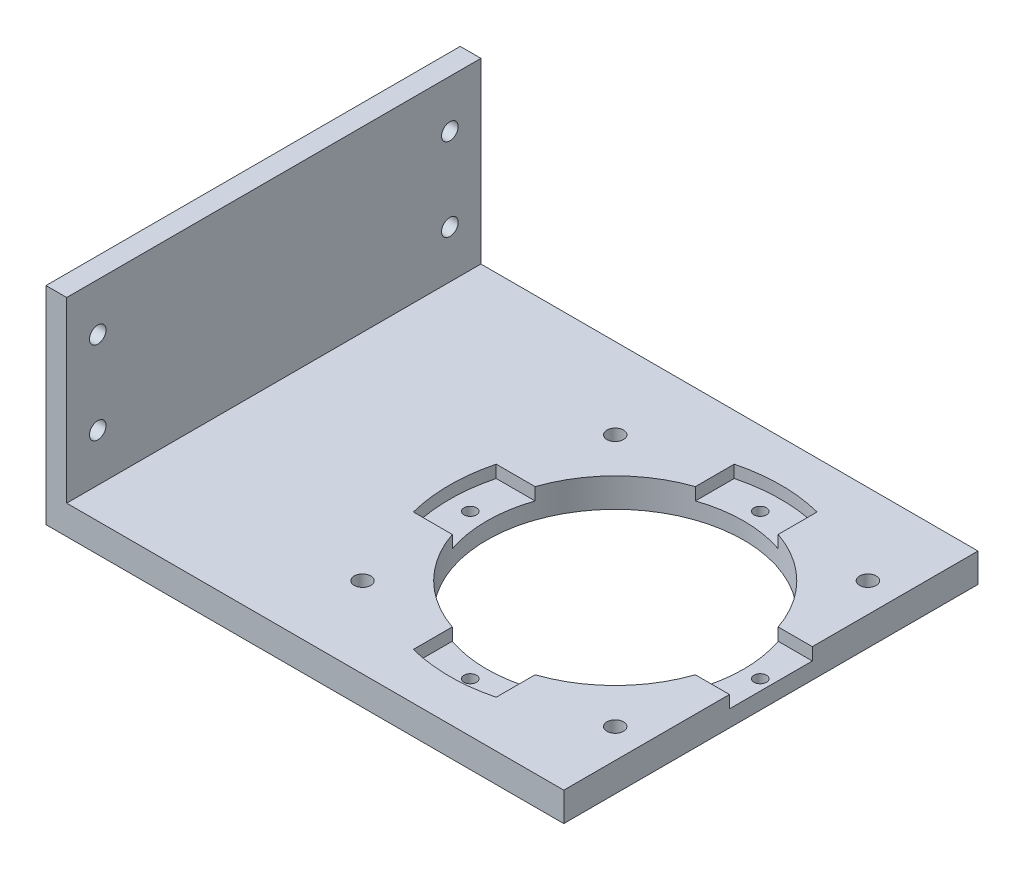
ISO-10303-21;
HEADER;
FILE_DESCRIPTION(('STEP AP214'),'2;1');
FILE_NAME('part.step','',(''),(''),'','','');
FILE_SCHEMA(('AUTOMOTIVE_DESIGN { 1 0 10303 214 1 1 1 1 }'));
ENDSEC;
DATA;
#1=APPLICATION_CONTEXT('core data for automotive mechanical design processes');
#2=APPLICATION_PROTOCOL_DEFINITION('international standard','automotive_design',2000,#1);
#3=PRODUCT_CONTEXT('',#1,'mechanical');
#4=PRODUCT('Part','Part','',(#3));
#5=PRODUCT_RELATED_PRODUCT_CATEGORY('part','',(#4));
#6=PRODUCT_DEFINITION_FORMATION('','',#4);
#7=PRODUCT_DEFINITION_CONTEXT('part definition',#1,'design');
#8=PRODUCT_DEFINITION('design','',#6,#7);
#9=PRODUCT_DEFINITION_SHAPE('','',#8);
#10=(LENGTH_UNIT() NAMED_UNIT(*) SI_UNIT(.MILLI.,.METRE.));
#11=(NAMED_UNIT(*) PLANE_ANGLE_UNIT() SI_UNIT($,.RADIAN.));
#12=(NAMED_UNIT(*) SI_UNIT($,.STERADIAN.) SOLID_ANGLE_UNIT());
#13=UNCERTAINTY_MEASURE_WITH_UNIT(LENGTH_MEASURE(1.E-05),#10,'distance_accuracy_value','');
#14=(GEOMETRIC_REPRESENTATION_CONTEXT(3) GLOBAL_UNCERTAINTY_ASSIGNED_CONTEXT((#13)) GLOBAL_UNIT_ASSIGNED_CONTEXT((#10,
#11,#12)) REPRESENTATION_CONTEXT('',''));
#15=CARTESIAN_POINT('',(0.,0.,0.));
#16=DIRECTION('',(0.,0.,1.));
#17=DIRECTION('',(1.,0.,0.));
#18=AXIS2_PLACEMENT_3D('',#15,#16,#17);
#19=CARTESIAN_POINT('',(0.,50.,100.));
#20=DIRECTION('',(1.,0.,0.));
#21=DIRECTION('',(0.,1.,0.));
#22=AXIS2_PLACEMENT_3D('',#19,#20,#21);
#23=PLANE('',#22);
#24=CARTESIAN_POINT('',(0.,18.5,92.5));
#25=DIRECTION('',(1.,0.,0.));
#26=DIRECTION('',(0.,1.,0.));
#27=AXIS2_PLACEMENT_3D('',#24,#25,#26);
#28=CIRCLE('',#27,2.);
#29=CARTESIAN_POINT('',(0.,20.5,92.5));
#30=VERTEX_POINT('',#29);
#31=EDGE_CURVE('E317',#30,#30,#28,.F.);
#32=ORIENTED_EDGE('',*,*,#31,.F.);
#33=EDGE_LOOP('',(#32));
#34=FACE_BOUND('',#33,.T.);
#35=CARTESIAN_POINT('',(0.,38.5,7.5));
#36=DIRECTION('',(1.,0.,0.));
#37=DIRECTION('',(0.,1.,0.));
#38=AXIS2_PLACEMENT_3D('',#35,#36,#37);
#39=CIRCLE('',#38,2.);
#40=CARTESIAN_POINT('',(0.,40.5,7.5));
#41=VERTEX_POINT('',#40);
#42=EDGE_CURVE('E318',#41,#41,#39,.F.);
#43=ORIENTED_EDGE('',*,*,#42,.F.);
#44=EDGE_LOOP('',(#43));
#45=FACE_BOUND('',#44,.T.);
#46=CARTESIAN_POINT('',(0.,18.5,7.49999999999999));
#47=DIRECTION('',(1.,0.,0.));
#48=DIRECTION('',(0.,1.,0.));
#49=AXIS2_PLACEMENT_3D('',#46,#47,#48);
#50=CIRCLE('',#49,2.);
#51=CARTESIAN_POINT('',(0.,20.5,7.49999999999999));
#52=VERTEX_POINT('',#51);
#53=EDGE_CURVE('E310',#52,#52,#50,.F.);
#54=ORIENTED_EDGE('',*,*,#53,.F.);
#55=EDGE_LOOP('',(#54));
#56=FACE_BOUND('',#55,.T.);
#57=CARTESIAN_POINT('',(0.,38.5,92.5));
#58=DIRECTION('',(1.,0.,0.));
#59=DIRECTION('',(0.,1.,0.));
#60=AXIS2_PLACEMENT_3D('',#57,#58,#59);
#61=CIRCLE('',#60,2.);
#62=CARTESIAN_POINT('',(0.,40.5,92.5));
#63=VERTEX_POINT('',#62);
#64=EDGE_CURVE('E328',#63,#63,#61,.F.);
#65=ORIENTED_EDGE('',*,*,#64,.F.);
#66=EDGE_LOOP('',(#65));
#67=FACE_BOUND('',#66,.T.);
#68=DIRECTION('',(0.,-1.,0.));
#69=VECTOR('',#68,1.);
#70=CARTESIAN_POINT('',(0.,50.,0.));
#71=LINE('',#70,#69);
#72=CARTESIAN_POINT('',(0.,50.,0.));
#73=VERTEX_POINT('',#72);
#74=CARTESIAN_POINT('',(0.,0.,0.));
#75=VERTEX_POINT('',#74);
#76=EDGE_CURVE('E363',#73,#75,#71,.T.);
#77=ORIENTED_EDGE('',*,*,#76,.T.);
#78=DIRECTION('',(0.,0.,-1.));
#79=VECTOR('',#78,1.);
#80=CARTESIAN_POINT('',(0.,0.,100.));
#81=LINE('',#80,#79);
#82=CARTESIAN_POINT('',(0.,0.,100.));
#83=VERTEX_POINT('',#82);
#84=EDGE_CURVE('E13',#83,#75,#81,.T.);
#85=ORIENTED_EDGE('',*,*,#84,.F.);
#86=DIRECTION('',(0.,-1.,0.));
#87=VECTOR('',#86,1.);
#88=CARTESIAN_POINT('',(0.,50.,100.));
#89=LINE('',#88,#87);
#90=CARTESIAN_POINT('',(0.,50.,100.));
#91=VERTEX_POINT('',#90);
#92=EDGE_CURVE('E364',#91,#83,#89,.T.);
#93=ORIENTED_EDGE('',*,*,#92,.F.);
#94=DIRECTION('',(0.,0.,-1.));
#95=VECTOR('',#94,1.);
#96=CARTESIAN_POINT('',(0.,50.,100.));
#97=LINE('',#96,#95);
#98=EDGE_CURVE('E378',#91,#73,#97,.T.);
#99=ORIENTED_EDGE('',*,*,#98,.T.);
#100=EDGE_LOOP('',(#77,#85,#93,#99));
#101=FACE_BOUND('',#100,.T.);
#102=ADVANCED_FACE('F44',(#34,#45,#56,#67,#101),#23,.F.);
#103=CARTESIAN_POINT('',(0.,0.,100.));
#104=DIRECTION('',(0.,1.,0.));
#105=DIRECTION('',(0.,0.,1.));
#106=AXIS2_PLACEMENT_3D('',#103,#104,#105);
#107=PLANE('',#106);
#108=CARTESIAN_POINT('',(87.42,0.,15.));
#109=DIRECTION('',(0.,1.,0.));
#110=DIRECTION('',(0.,0.,1.));
#111=AXIS2_PLACEMENT_3D('',#108,#109,#110);
#112=CIRCLE('',#111,1.5);
#113=CARTESIAN_POINT('',(87.42,0.,16.5));
#114=VERTEX_POINT('',#113);
#115=EDGE_CURVE('E289',#114,#114,#112,.F.);
#116=ORIENTED_EDGE('',*,*,#115,.F.);
#117=EDGE_LOOP('',(#116));
#118=FACE_BOUND('',#117,.T.);
#119=CARTESIAN_POINT('',(122.420000000001,0.,49.9999999999996));
#120=DIRECTION('',(0.,1.,0.));
#121=DIRECTION('',(0.,0.,1.));
#122=AXIS2_PLACEMENT_3D('',#119,#120,#121);
#123=CIRCLE('',#122,1.5);
#124=CARTESIAN_POINT('',(122.420000000001,0.,51.4999999999996));
#125=VERTEX_POINT('',#124);
#126=EDGE_CURVE('E762',#125,#125,#123,.F.);
#127=ORIENTED_EDGE('',*,*,#126,.F.);
#128=EDGE_LOOP('',(#127));
#129=FACE_BOUND('',#128,.T.);
#130=CARTESIAN_POINT('',(87.4200000000007,0.,85.));
#131=DIRECTION('',(0.,1.,0.));
#132=DIRECTION('',(0.,0.,1.));
#133=AXIS2_PLACEMENT_3D('',#130,#131,#132);
#134=CIRCLE('',#133,1.50000000000001);
#135=CARTESIAN_POINT('',(87.4200000000007,0.,86.5));
#136=VERTEX_POINT('',#135);
#137=EDGE_CURVE('E756',#136,#136,#134,.F.);
#138=ORIENTED_EDGE('',*,*,#137,.F.);
#139=EDGE_LOOP('',(#138));
#140=FACE_BOUND('',#139,.T.);
#141=CARTESIAN_POINT('',(52.4200000000005,0.,50.0000000000001));
#142=DIRECTION('',(0.,1.,0.));
#143=DIRECTION('',(0.,0.,1.));
#144=AXIS2_PLACEMENT_3D('',#141,#142,#143);
#145=CIRCLE('',#144,1.49999999999999);
#146=CARTESIAN_POINT('',(52.4200000000005,0.,51.5000000000001));
#147=VERTEX_POINT('',#146);
#148=EDGE_CURVE('E218',#147,#147,#145,.F.);
#149=ORIENTED_EDGE('',*,*,#148,.F.);
#150=EDGE_LOOP('',(#149));
#151=FACE_BOUND('',#150,.T.);
#152=CARTESIAN_POINT('',(117.92,0.,80.5));
#153=DIRECTION('',(0.,1.,0.));
#154=DIRECTION('',(0.,0.,1.));
#155=AXIS2_PLACEMENT_3D('',#152,#153,#154);
#156=CIRCLE('',#155,2.);
#157=CARTESIAN_POINT('',(117.92,0.,82.5));
#158=VERTEX_POINT('',#157);
#159=EDGE_CURVE('E349',#158,#158,#156,.F.);
#160=ORIENTED_EDGE('',*,*,#159,.F.);
#161=EDGE_LOOP('',(#160));
#162=FACE_BOUND('',#161,.T.);
#163=CARTESIAN_POINT('',(117.92,0.,19.5));
#164=DIRECTION('',(0.,1.,0.));
#165=DIRECTION('',(0.,0.,1.));
#166=AXIS2_PLACEMENT_3D('',#163,#164,#165);
#167=CIRCLE('',#166,2.);
#168=CARTESIAN_POINT('',(117.92,0.,21.5));
#169=VERTEX_POINT('',#168);
#170=EDGE_CURVE('E343',#169,#169,#167,.F.);
#171=ORIENTED_EDGE('',*,*,#170,.F.);
#172=EDGE_LOOP('',(#171));
#173=FACE_BOUND('',#172,.T.);
#174=CARTESIAN_POINT('',(56.92,0.,80.5));
#175=DIRECTION('',(0.,1.,0.));
#176=DIRECTION('',(0.,0.,1.));
#177=AXIS2_PLACEMENT_3D('',#174,#175,#176);
#178=CIRCLE('',#177,2.);
#179=CARTESIAN_POINT('',(56.92,0.,82.5));
#180=VERTEX_POINT('',#179);
#181=EDGE_CURVE('E336',#180,#180,#178,.F.);
#182=ORIENTED_EDGE('',*,*,#181,.F.);
#183=EDGE_LOOP('',(#182));
#184=FACE_BOUND('',#183,.T.);
#185=CARTESIAN_POINT('',(56.92,0.,19.5));
#186=DIRECTION('',(0.,1.,0.));
#187=DIRECTION('',(0.,0.,1.));
#188=AXIS2_PLACEMENT_3D('',#185,#186,#187);
#189=CIRCLE('',#188,2.);
#190=CARTESIAN_POINT('',(56.92,0.,21.5));
#191=VERTEX_POINT('',#190);
#192=EDGE_CURVE('E335',#191,#191,#189,.F.);
#193=ORIENTED_EDGE('',*,*,#192,.F.);
#194=EDGE_LOOP('',(#193));
#195=FACE_BOUND('',#194,.T.);
#196=CARTESIAN_POINT('',(87.42,0.,50.));
#197=DIRECTION('',(0.,1.,0.));
#198=DIRECTION('',(0.,0.,1.));
#199=AXIS2_PLACEMENT_3D('',#196,#197,#198);
#200=CIRCLE('',#199,31.);
#201=CARTESIAN_POINT('',(87.42,0.,81.));
#202=VERTEX_POINT('',#201);
#203=EDGE_CURVE('E359',#202,#202,#200,.F.);
#204=ORIENTED_EDGE('',*,*,#203,.F.);
#205=EDGE_LOOP('',(#204));
#206=FACE_BOUND('',#205,.T.);
#207=DIRECTION('',(1.,0.,0.));
#208=VECTOR('',#207,1.);
#209=CARTESIAN_POINT('',(0.,0.,0.));
#210=LINE('',#209,#208);
#211=CARTESIAN_POINT('',(125.,0.,0.));
#212=VERTEX_POINT('',#211);
#213=EDGE_CURVE('E381',#75,#212,#210,.T.);
#214=ORIENTED_EDGE('',*,*,#213,.T.);
#215=DIRECTION('',(0.,0.,-1.));
#216=VECTOR('',#215,1.);
#217=CARTESIAN_POINT('',(125.,0.,100.));
#218=LINE('',#217,#216);
#219=CARTESIAN_POINT('',(125.,0.,100.));
#220=VERTEX_POINT('',#219);
#221=EDGE_CURVE('E51',#220,#212,#218,.T.);
#222=ORIENTED_EDGE('',*,*,#221,.F.);
#223=DIRECTION('',(1.,0.,0.));
#224=VECTOR('',#223,1.);
#225=CARTESIAN_POINT('',(0.,0.,100.));
#226=LINE('',#225,#224);
#227=EDGE_CURVE('E367',#83,#220,#226,.T.);
#228=ORIENTED_EDGE('',*,*,#227,.F.);
#229=ORIENTED_EDGE('',*,*,#84,.T.);
#230=EDGE_LOOP('',(#214,#222,#228,#229));
#231=FACE_BOUND('',#230,.T.);
#232=ADVANCED_FACE('F494',(#118,#129,#140,#151,#162,#173,#184,#195,#206,#231),#107,.F.);
#233=CARTESIAN_POINT('',(125.,0.,100.));
#234=DIRECTION('',(-1.,0.,0.));
#235=DIRECTION('',(0.,0.,1.));
#236=AXIS2_PLACEMENT_3D('',#233,#234,#235);
#237=PLANE('',#236);
#238=DIRECTION('',(0.,0.,-1.));
#239=VECTOR('',#238,1.);
#240=CARTESIAN_POINT('',(125.,4.,100.));
#241=LINE('',#240,#239);
#242=CARTESIAN_POINT('',(125.,4.,60.));
#243=VERTEX_POINT('',#242);
#244=CARTESIAN_POINT('',(125.,4.,40.));
#245=VERTEX_POINT('',#244);
#246=EDGE_CURVE('E228',#243,#245,#241,.T.);
#247=ORIENTED_EDGE('',*,*,#246,.F.);
#248=DIRECTION('',(0.,1.,0.));
#249=VECTOR('',#248,1.);
#250=CARTESIAN_POINT('',(125.,0.,60.));
#251=LINE('',#250,#249);
#252=CARTESIAN_POINT('',(125.,7.,60.));
#253=VERTEX_POINT('',#252);
#254=EDGE_CURVE('E304',#243,#253,#251,.T.);
#255=ORIENTED_EDGE('',*,*,#254,.T.);
#256=DIRECTION('',(0.,0.,-1.));
#257=VECTOR('',#256,1.);
#258=CARTESIAN_POINT('',(125.,7.,100.));
#259=LINE('',#258,#257);
#260=CARTESIAN_POINT('',(125.,7.,100.));
#261=VERTEX_POINT('',#260);
#262=EDGE_CURVE('E400',#261,#253,#259,.T.);
#263=ORIENTED_EDGE('',*,*,#262,.F.);
#264=DIRECTION('',(0.,1.,0.));
#265=VECTOR('',#264,1.);
#266=CARTESIAN_POINT('',(125.,0.,100.));
#267=LINE('',#266,#265);
#268=EDGE_CURVE('E370',#220,#261,#267,.T.);
#269=ORIENTED_EDGE('',*,*,#268,.F.);
#270=ORIENTED_EDGE('',*,*,#221,.T.);
#271=DIRECTION('',(0.,1.,0.));
#272=VECTOR('',#271,1.);
#273=CARTESIAN_POINT('',(125.,0.,0.));
#274=LINE('',#273,#272);
#275=CARTESIAN_POINT('',(125.,7.,0.));
#276=VERTEX_POINT('',#275);
#277=EDGE_CURVE('E383',#212,#276,#274,.T.);
#278=ORIENTED_EDGE('',*,*,#277,.T.);
#279=CARTESIAN_POINT('',(125.,7.,40.));
#280=VERTEX_POINT('',#279);
#281=EDGE_CURVE('E399',#280,#276,#259,.T.);
#282=ORIENTED_EDGE('',*,*,#281,.F.);
#283=DIRECTION('',(0.,-1.,0.));
#284=VECTOR('',#283,1.);
#285=CARTESIAN_POINT('',(125.,0.,40.));
#286=LINE('',#285,#284);
#287=EDGE_CURVE('E301',#280,#245,#286,.T.);
#288=ORIENTED_EDGE('',*,*,#287,.T.);
#289=EDGE_LOOP('',(#247,#255,#263,#269,#270,#278,#282,#288));
#290=FACE_BOUND('',#289,.T.);
#291=ADVANCED_FACE('F408',(#290),#237,.F.);
#292=CARTESIAN_POINT('',(125.,7.,100.));
#293=DIRECTION('',(0.,-1.,0.));
#294=DIRECTION('',(1.,0.,0.));
#295=AXIS2_PLACEMENT_3D('',#292,#293,#294);
#296=PLANE('',#295);
#297=CARTESIAN_POINT('',(117.92,7.,80.5));
#298=DIRECTION('',(0.,1.,0.));
#299=DIRECTION('',(-1.,0.,0.));
#300=AXIS2_PLACEMENT_3D('',#297,#298,#299);
#301=CIRCLE('',#300,2.);
#302=CARTESIAN_POINT('',(115.92,7.,80.5));
#303=VERTEX_POINT('',#302);
#304=EDGE_CURVE('E331',#303,#303,#301,.T.);
#305=ORIENTED_EDGE('',*,*,#304,.F.);
#306=EDGE_LOOP('',(#305));
#307=FACE_BOUND('',#306,.T.);
#308=CARTESIAN_POINT('',(117.92,7.,19.5));
#309=DIRECTION('',(0.,1.,0.));
#310=DIRECTION('',(1.,0.,0.));
#311=AXIS2_PLACEMENT_3D('',#308,#309,#310);
#312=CIRCLE('',#311,2.);
#313=CARTESIAN_POINT('',(119.92,7.,19.5));
#314=VERTEX_POINT('',#313);
#315=EDGE_CURVE('E346',#314,#314,#312,.T.);
#316=ORIENTED_EDGE('',*,*,#315,.F.);
#317=EDGE_LOOP('',(#316));
#318=FACE_BOUND('',#317,.T.);
#319=CARTESIAN_POINT('',(56.92,6.99999999999999,80.5));
#320=DIRECTION('',(0.,1.,0.));
#321=DIRECTION('',(1.,0.,0.));
#322=AXIS2_PLACEMENT_3D('',#319,#320,#321);
#323=CIRCLE('',#322,2.);
#324=CARTESIAN_POINT('',(58.92,6.99999999999999,80.5));
#325=VERTEX_POINT('',#324);
#326=EDGE_CURVE('E340',#325,#325,#323,.T.);
#327=ORIENTED_EDGE('',*,*,#326,.F.);
#328=EDGE_LOOP('',(#327));
#329=FACE_BOUND('',#328,.T.);
#330=CARTESIAN_POINT('',(56.92,6.99999999999999,19.5));
#331=DIRECTION('',(0.,1.,0.));
#332=DIRECTION('',(-1.,0.,0.));
#333=AXIS2_PLACEMENT_3D('',#330,#331,#332);
#334=CIRCLE('',#333,2.);
#335=CARTESIAN_POINT('',(54.92,6.99999999999999,19.5));
#336=VERTEX_POINT('',#335);
#337=EDGE_CURVE('E332',#336,#336,#334,.T.);
#338=ORIENTED_EDGE('',*,*,#337,.F.);
#339=EDGE_LOOP('',(#338));
#340=FACE_BOUND('',#339,.T.);
#341=CARTESIAN_POINT('',(87.42,6.99999999999999,50.));
#342=DIRECTION('',(0.,1.,0.));
#343=DIRECTION('',(-1.,0.,0.));
#344=AXIS2_PLACEMENT_3D('',#341,#342,#343);
#345=CIRCLE('',#344,40.);
#346=CARTESIAN_POINT('',(97.42,7.,11.2701665379258));
#347=VERTEX_POINT('',#346);
#348=CARTESIAN_POINT('',(77.42,6.99999999999999,11.2701665379258));
#349=VERTEX_POINT('',#348);
#350=EDGE_CURVE('E199',#347,#349,#345,.T.);
#351=ORIENTED_EDGE('',*,*,#350,.F.);
#352=DIRECTION('',(0.,0.,-1.));
#353=VECTOR('',#352,1.);
#354=CARTESIAN_POINT('',(97.42,7.,20.6571984977576));
#355=LINE('',#354,#353);
#356=CARTESIAN_POINT('',(97.42,7.,20.6571984977576));
#357=VERTEX_POINT('',#356);
#358=EDGE_CURVE('E212',#357,#347,#355,.T.);
#359=ORIENTED_EDGE('',*,*,#358,.F.);
#360=CARTESIAN_POINT('',(87.42,6.99999999999999,50.));
#361=DIRECTION('',(0.,1.,0.));
#362=DIRECTION('',(-1.,0.,0.));
#363=AXIS2_PLACEMENT_3D('',#360,#361,#362);
#364=CIRCLE('',#363,31.);
#365=CARTESIAN_POINT('',(116.762801502242,7.,40.0000000000001));
#366=VERTEX_POINT('',#365);
#367=EDGE_CURVE('E449',#366,#357,#364,.T.);
#368=ORIENTED_EDGE('',*,*,#367,.F.);
#369=DIRECTION('',(-1.,0.,0.));
#370=VECTOR('',#369,1.);
#371=CARTESIAN_POINT('',(116.762801502242,7.,40.0000000000001));
#372=LINE('',#371,#370);
#373=EDGE_CURVE('E240',#280,#366,#372,.T.);
#374=ORIENTED_EDGE('',*,*,#373,.F.);
#375=ORIENTED_EDGE('',*,*,#281,.T.);
#376=DIRECTION('',(-1.,0.,0.));
#377=VECTOR('',#376,1.);
#378=CARTESIAN_POINT('',(125.,7.,0.));
#379=LINE('',#378,#377);
#380=CARTESIAN_POINT('',(5.,6.99999999999999,0.));
#381=VERTEX_POINT('',#380);
#382=EDGE_CURVE('E386',#276,#381,#379,.T.);
#383=ORIENTED_EDGE('',*,*,#382,.T.);
#384=DIRECTION('',(0.,0.,-1.));
#385=VECTOR('',#384,1.);
#386=CARTESIAN_POINT('',(5.,6.99999999999999,100.));
#387=LINE('',#386,#385);
#388=CARTESIAN_POINT('',(5.,6.99999999999999,100.));
#389=VERTEX_POINT('',#388);
#390=EDGE_CURVE('E396',#389,#381,#387,.T.);
#391=ORIENTED_EDGE('',*,*,#390,.F.);
#392=DIRECTION('',(-1.,0.,0.));
#393=VECTOR('',#392,1.);
#394=CARTESIAN_POINT('',(125.,7.,100.));
#395=LINE('',#394,#393);
#396=EDGE_CURVE('E372',#261,#389,#395,.T.);
#397=ORIENTED_EDGE('',*,*,#396,.F.);
#398=ORIENTED_EDGE('',*,*,#262,.T.);
#399=DIRECTION('',(1.,0.,0.));
#400=VECTOR('',#399,1.);
#401=CARTESIAN_POINT('',(116.762801502242,7.,60.0000000000001));
#402=LINE('',#401,#400);
#403=CARTESIAN_POINT('',(116.762801502242,7.,60.0000000000001));
#404=VERTEX_POINT('',#403);
#405=EDGE_CURVE('E235',#404,#253,#402,.T.);
#406=ORIENTED_EDGE('',*,*,#405,.F.);
#407=CARTESIAN_POINT('',(97.4199999999998,7.,79.3428015022425));
#408=VERTEX_POINT('',#407);
#409=EDGE_CURVE('E360',#408,#404,#364,.T.);
#410=ORIENTED_EDGE('',*,*,#409,.F.);
#411=DIRECTION('',(0.,0.,-1.));
#412=VECTOR('',#411,1.);
#413=CARTESIAN_POINT('',(97.4199999999998,7.,79.3428015022425));
#414=LINE('',#413,#412);
#415=CARTESIAN_POINT('',(97.42,7.,88.7298334620742));
#416=VERTEX_POINT('',#415);
#417=EDGE_CURVE('E261',#416,#408,#414,.T.);
#418=ORIENTED_EDGE('',*,*,#417,.F.);
#419=CARTESIAN_POINT('',(87.42,6.99999999999999,50.));
#420=DIRECTION('',(0.,1.,0.));
#421=DIRECTION('',(-1.,0.,0.));
#422=AXIS2_PLACEMENT_3D('',#419,#420,#421);
#423=CIRCLE('',#422,40.);
#424=CARTESIAN_POINT('',(77.42,6.99999999999999,88.7298334620742));
#425=VERTEX_POINT('',#424);
#426=EDGE_CURVE('E258',#425,#416,#423,.T.);
#427=ORIENTED_EDGE('',*,*,#426,.F.);
#428=DIRECTION('',(0.,0.,1.));
#429=VECTOR('',#428,1.);
#430=CARTESIAN_POINT('',(77.4199999999998,6.99999999999999,79.3428015022424));
#431=LINE('',#430,#429);
#432=CARTESIAN_POINT('',(77.4199999999998,6.99999999999999,79.3428015022424));
#433=VERTEX_POINT('',#432);
#434=EDGE_CURVE('E250',#433,#425,#431,.T.);
#435=ORIENTED_EDGE('',*,*,#434,.F.);
#436=CARTESIAN_POINT('',(58.0771984977575,6.99999999999999,59.9999999999997));
#437=VERTEX_POINT('',#436);
#438=EDGE_CURVE('E356',#437,#433,#364,.T.);
#439=ORIENTED_EDGE('',*,*,#438,.F.);
#440=DIRECTION('',(1.,0.,0.));
#441=VECTOR('',#440,1.);
#442=CARTESIAN_POINT('',(58.0771984977575,6.99999999999999,59.9999999999997));
#443=LINE('',#442,#441);
#444=CARTESIAN_POINT('',(48.6901665379258,6.99999999999999,60.));
#445=VERTEX_POINT('',#444);
#446=EDGE_CURVE('E288',#445,#437,#443,.T.);
#447=ORIENTED_EDGE('',*,*,#446,.F.);
#448=CARTESIAN_POINT('',(87.42,6.99999999999999,50.));
#449=DIRECTION('',(0.,1.,0.));
#450=DIRECTION('',(-1.,0.,0.));
#451=AXIS2_PLACEMENT_3D('',#448,#449,#450);
#452=CIRCLE('',#451,40.);
#453=CARTESIAN_POINT('',(48.6901665379258,6.99999999999999,40.));
#454=VERTEX_POINT('',#453);
#455=EDGE_CURVE('E285',#454,#445,#452,.T.);
#456=ORIENTED_EDGE('',*,*,#455,.F.);
#457=DIRECTION('',(-1.,0.,0.));
#458=VECTOR('',#457,1.);
#459=CARTESIAN_POINT('',(58.0771984977577,6.99999999999999,39.9999999999997));
#460=LINE('',#459,#458);
#461=CARTESIAN_POINT('',(58.0771984977577,6.99999999999999,39.9999999999997));
#462=VERTEX_POINT('',#461);
#463=EDGE_CURVE('E277',#462,#454,#460,.T.);
#464=ORIENTED_EDGE('',*,*,#463,.F.);
#465=CARTESIAN_POINT('',(77.42,6.99999999999999,20.6571984977576));
#466=VERTEX_POINT('',#465);
#467=EDGE_CURVE('E339',#466,#462,#364,.T.);
#468=ORIENTED_EDGE('',*,*,#467,.F.);
#469=DIRECTION('',(0.,0.,1.));
#470=VECTOR('',#469,1.);
#471=CARTESIAN_POINT('',(77.42,6.99999999999999,20.6571984977576));
#472=LINE('',#471,#470);
#473=EDGE_CURVE('E215',#349,#466,#472,.T.);
#474=ORIENTED_EDGE('',*,*,#473,.F.);
#475=EDGE_LOOP('',(#351,#359,#368,#374,#375,#383,#391,#397,#398,#406,#410,#418,#427,#435,#439,
#447,#456,#464,#468,#474));
#476=FACE_BOUND('',#475,.T.);
#477=ADVANCED_FACE('F420',(#307,#318,#329,#340,#476),#296,.F.);
#478=CARTESIAN_POINT('',(5.,6.99999999999999,100.));
#479=DIRECTION('',(-1.,0.,0.));
#480=DIRECTION('',(0.,0.,1.));
#481=AXIS2_PLACEMENT_3D('',#478,#479,#480);
#482=PLANE('',#481);
#483=CARTESIAN_POINT('',(5.,18.5,92.5));
#484=DIRECTION('',(1.,0.,0.));
#485=DIRECTION('',(0.,0.,1.));
#486=AXIS2_PLACEMENT_3D('',#483,#484,#485);
#487=CIRCLE('',#486,2.);
#488=CARTESIAN_POINT('',(5.,18.5,94.5));
#489=VERTEX_POINT('',#488);
#490=EDGE_CURVE('E314',#489,#489,#487,.T.);
#491=ORIENTED_EDGE('',*,*,#490,.F.);
#492=EDGE_LOOP('',(#491));
#493=FACE_BOUND('',#492,.T.);
#494=CARTESIAN_POINT('',(5.,38.5,7.5));
#495=DIRECTION('',(1.,0.,0.));
#496=DIRECTION('',(0.,0.,1.));
#497=AXIS2_PLACEMENT_3D('',#494,#495,#496);
#498=CIRCLE('',#497,2.);
#499=CARTESIAN_POINT('',(5.,38.5,9.5));
#500=VERTEX_POINT('',#499);
#501=EDGE_CURVE('E313',#500,#500,#498,.T.);
#502=ORIENTED_EDGE('',*,*,#501,.F.);
#503=EDGE_LOOP('',(#502));
#504=FACE_BOUND('',#503,.T.);
#505=CARTESIAN_POINT('',(5.,18.5,7.49999999999999));
#506=DIRECTION('',(1.,0.,0.));
#507=DIRECTION('',(0.,0.,-1.));
#508=AXIS2_PLACEMENT_3D('',#505,#506,#507);
#509=CIRCLE('',#508,2.);
#510=CARTESIAN_POINT('',(5.,18.5,5.49999999999999));
#511=VERTEX_POINT('',#510);
#512=EDGE_CURVE('E307',#511,#511,#509,.T.);
#513=ORIENTED_EDGE('',*,*,#512,.F.);
#514=EDGE_LOOP('',(#513));
#515=FACE_BOUND('',#514,.T.);
#516=CARTESIAN_POINT('',(5.,38.5,92.5));
#517=DIRECTION('',(1.,0.,0.));
#518=DIRECTION('',(0.,0.,-1.));
#519=AXIS2_PLACEMENT_3D('',#516,#517,#518);
#520=CIRCLE('',#519,2.);
#521=CARTESIAN_POINT('',(5.,38.5,90.5));
#522=VERTEX_POINT('',#521);
#523=EDGE_CURVE('E321',#522,#522,#520,.T.);
#524=ORIENTED_EDGE('',*,*,#523,.F.);
#525=EDGE_LOOP('',(#524));
#526=FACE_BOUND('',#525,.T.);
#527=DIRECTION('',(0.,1.,0.));
#528=VECTOR('',#527,1.);
#529=CARTESIAN_POINT('',(5.,6.99999999999999,0.));
#530=LINE('',#529,#528);
#531=CARTESIAN_POINT('',(5.,50.,0.));
#532=VERTEX_POINT('',#531);
#533=EDGE_CURVE('E388',#381,#532,#530,.T.);
#534=ORIENTED_EDGE('',*,*,#533,.T.);
#535=DIRECTION('',(0.,0.,-1.));
#536=VECTOR('',#535,1.);
#537=CARTESIAN_POINT('',(5.,50.,100.));
#538=LINE('',#537,#536);
#539=CARTESIAN_POINT('',(5.,50.,100.));
#540=VERTEX_POINT('',#539);
#541=EDGE_CURVE('E393',#540,#532,#538,.T.);
#542=ORIENTED_EDGE('',*,*,#541,.F.);
#543=DIRECTION('',(0.,1.,0.));
#544=VECTOR('',#543,1.);
#545=CARTESIAN_POINT('',(5.,6.99999999999999,100.));
#546=LINE('',#545,#544);
#547=EDGE_CURVE('E374',#389,#540,#546,.T.);
#548=ORIENTED_EDGE('',*,*,#547,.F.);
#549=ORIENTED_EDGE('',*,*,#390,.T.);
#550=EDGE_LOOP('',(#534,#542,#548,#549));
#551=FACE_BOUND('',#550,.T.);
#552=ADVANCED_FACE('F425',(#493,#504,#515,#526,#551),#482,.F.);
#553=CARTESIAN_POINT('',(5.,50.,100.));
#554=DIRECTION('',(0.,-1.,0.));
#555=DIRECTION('',(0.,0.,-1.));
#556=AXIS2_PLACEMENT_3D('',#553,#554,#555);
#557=PLANE('',#556);
#558=DIRECTION('',(-1.,0.,0.));
#559=VECTOR('',#558,1.);
#560=CARTESIAN_POINT('',(5.,50.,0.));
#561=LINE('',#560,#559);
#562=EDGE_CURVE('E368',#532,#73,#561,.T.);
#563=ORIENTED_EDGE('',*,*,#562,.T.);
#564=ORIENTED_EDGE('',*,*,#98,.F.);
#565=DIRECTION('',(-1.,0.,0.));
#566=VECTOR('',#565,1.);
#567=CARTESIAN_POINT('',(5.,50.,100.));
#568=LINE('',#567,#566);
#569=EDGE_CURVE('E376',#540,#91,#568,.T.);
#570=ORIENTED_EDGE('',*,*,#569,.F.);
#571=ORIENTED_EDGE('',*,*,#541,.T.);
#572=EDGE_LOOP('',(#563,#564,#570,#571));
#573=FACE_BOUND('',#572,.T.);
#574=ADVANCED_FACE('F511',(#573),#557,.F.);
#575=CARTESIAN_POINT('',(0.,0.,100.));
#576=DIRECTION('',(0.,0.,1.));
#577=DIRECTION('',(1.,0.,0.));
#578=AXIS2_PLACEMENT_3D('',#575,#576,#577);
#579=PLANE('',#578);
#580=ORIENTED_EDGE('',*,*,#92,.T.);
#581=ORIENTED_EDGE('',*,*,#227,.T.);
#582=ORIENTED_EDGE('',*,*,#268,.T.);
#583=ORIENTED_EDGE('',*,*,#396,.T.);
#584=ORIENTED_EDGE('',*,*,#547,.T.);
#585=ORIENTED_EDGE('',*,*,#569,.T.);
#586=EDGE_LOOP('',(#580,#581,#582,#583,#584,#585));
#587=FACE_BOUND('',#586,.T.);
#588=ADVANCED_FACE('F429',(#587),#579,.T.);
#589=CARTESIAN_POINT('',(0.,0.,0.));
#590=DIRECTION('',(0.,0.,1.));
#591=DIRECTION('',(1.,0.,0.));
#592=AXIS2_PLACEMENT_3D('',#589,#590,#591);
#593=PLANE('',#592);
#594=ORIENTED_EDGE('',*,*,#76,.F.);
#595=ORIENTED_EDGE('',*,*,#562,.F.);
#596=ORIENTED_EDGE('',*,*,#533,.F.);
#597=ORIENTED_EDGE('',*,*,#382,.F.);
#598=ORIENTED_EDGE('',*,*,#277,.F.);
#599=ORIENTED_EDGE('',*,*,#213,.F.);
#600=EDGE_LOOP('',(#594,#595,#596,#597,#598,#599));
#601=FACE_BOUND('',#600,.T.);
#602=ADVANCED_FACE('F415',(#601),#593,.F.);
#603=CARTESIAN_POINT('',(87.42,-0.00100000000000534,50.));
#604=DIRECTION('',(0.,1.,0.));
#605=DIRECTION('',(-1.,0.,0.));
#606=AXIS2_PLACEMENT_3D('',#603,#604,#605);
#607=CYLINDRICAL_SURFACE('',#606,31.);
#608=ORIENTED_EDGE('',*,*,#367,.T.);
#609=DIRECTION('',(0.,1.,0.));
#610=VECTOR('',#609,1.);
#611=CARTESIAN_POINT('',(97.42,4.,20.6571984977576));
#612=LINE('',#611,#610);
#613=CARTESIAN_POINT('',(97.42,4.,20.6571984977576));
#614=VERTEX_POINT('',#613);
#615=EDGE_CURVE('E229',#614,#357,#612,.T.);
#616=ORIENTED_EDGE('',*,*,#615,.F.);
#617=CARTESIAN_POINT('',(87.42,3.99999999999999,50.));
#618=DIRECTION('',(0.,-1.,0.));
#619=DIRECTION('',(-1.,0.,0.));
#620=AXIS2_PLACEMENT_3D('',#617,#618,#619);
#621=CIRCLE('',#620,31.);
#622=CARTESIAN_POINT('',(77.42,3.99999999999999,20.6571984977576));
#623=VERTEX_POINT('',#622);
#624=EDGE_CURVE('E208',#623,#614,#621,.T.);
#625=ORIENTED_EDGE('',*,*,#624,.F.);
#626=DIRECTION('',(0.,1.,0.));
#627=VECTOR('',#626,1.);
#628=CARTESIAN_POINT('',(77.42,3.99999999999999,20.6571984977576));
#629=LINE('',#628,#627);
#630=EDGE_CURVE('E202',#623,#466,#629,.T.);
#631=ORIENTED_EDGE('',*,*,#630,.T.);
#632=ORIENTED_EDGE('',*,*,#467,.T.);
#633=DIRECTION('',(0.,1.,0.));
#634=VECTOR('',#633,1.);
#635=CARTESIAN_POINT('',(58.0771984977577,3.99999999999999,39.9999999999997));
#636=LINE('',#635,#634);
#637=CARTESIAN_POINT('',(58.0771984977577,3.99999999999999,39.9999999999997));
#638=VERTEX_POINT('',#637);
#639=EDGE_CURVE('E294',#638,#462,#636,.T.);
#640=ORIENTED_EDGE('',*,*,#639,.F.);
#641=CARTESIAN_POINT('',(87.42,3.99999999999999,50.));
#642=DIRECTION('',(0.,-1.,0.));
#643=DIRECTION('',(-1.,0.,0.));
#644=AXIS2_PLACEMENT_3D('',#641,#642,#643);
#645=CIRCLE('',#644,31.);
#646=CARTESIAN_POINT('',(58.0771984977575,3.99999999999999,59.9999999999997));
#647=VERTEX_POINT('',#646);
#648=EDGE_CURVE('E279',#647,#638,#645,.T.);
#649=ORIENTED_EDGE('',*,*,#648,.F.);
#650=DIRECTION('',(0.,1.,0.));
#651=VECTOR('',#650,1.);
#652=CARTESIAN_POINT('',(58.0771984977575,3.99999999999999,59.9999999999997));
#653=LINE('',#652,#651);
#654=EDGE_CURVE('E296',#647,#437,#653,.T.);
#655=ORIENTED_EDGE('',*,*,#654,.T.);
#656=ORIENTED_EDGE('',*,*,#438,.T.);
#657=DIRECTION('',(0.,1.,0.));
#658=VECTOR('',#657,1.);
#659=CARTESIAN_POINT('',(77.4199999999998,3.99999999999999,79.3428015022424));
#660=LINE('',#659,#658);
#661=CARTESIAN_POINT('',(77.4199999999998,3.99999999999999,79.3428015022424));
#662=VERTEX_POINT('',#661);
#663=EDGE_CURVE('E267',#662,#433,#660,.T.);
#664=ORIENTED_EDGE('',*,*,#663,.F.);
#665=CARTESIAN_POINT('',(87.42,3.99999999999999,50.));
#666=DIRECTION('',(0.,-1.,0.));
#667=DIRECTION('',(-1.,0.,0.));
#668=AXIS2_PLACEMENT_3D('',#665,#666,#667);
#669=CIRCLE('',#668,31.);
#670=CARTESIAN_POINT('',(97.4199999999998,4.,79.3428015022425));
#671=VERTEX_POINT('',#670);
#672=EDGE_CURVE('E252',#671,#662,#669,.T.);
#673=ORIENTED_EDGE('',*,*,#672,.F.);
#674=DIRECTION('',(0.,1.,0.));
#675=VECTOR('',#674,1.);
#676=CARTESIAN_POINT('',(97.4199999999998,4.,79.3428015022425));
#677=LINE('',#676,#675);
#678=EDGE_CURVE('E269',#671,#408,#677,.T.);
#679=ORIENTED_EDGE('',*,*,#678,.T.);
#680=ORIENTED_EDGE('',*,*,#409,.T.);
#681=DIRECTION('',(0.,1.,0.));
#682=VECTOR('',#681,1.);
#683=CARTESIAN_POINT('',(116.762801502242,4.,60.0000000000001));
#684=LINE('',#683,#682);
#685=CARTESIAN_POINT('',(116.762801502242,4.,60.0000000000001));
#686=VERTEX_POINT('',#685);
#687=EDGE_CURVE('E224',#686,#404,#684,.T.);
#688=ORIENTED_EDGE('',*,*,#687,.F.);
#689=CARTESIAN_POINT('',(87.42,3.99999999999999,50.));
#690=DIRECTION('',(0.,-1.,0.));
#691=DIRECTION('',(-1.,0.,0.));
#692=AXIS2_PLACEMENT_3D('',#689,#690,#691);
#693=CIRCLE('',#692,31.);
#694=CARTESIAN_POINT('',(116.762801502242,4.,40.0000000000001));
#695=VERTEX_POINT('',#694);
#696=EDGE_CURVE('E234',#695,#686,#693,.T.);
#697=ORIENTED_EDGE('',*,*,#696,.F.);
#698=DIRECTION('',(0.,1.,0.));
#699=VECTOR('',#698,1.);
#700=CARTESIAN_POINT('',(116.762801502242,4.,40.0000000000001));
#701=LINE('',#700,#699);
#702=EDGE_CURVE('E66',#695,#366,#701,.T.);
#703=ORIENTED_EDGE('',*,*,#702,.T.);
#704=EDGE_LOOP('',(#608,#616,#625,#631,#632,#640,#649,#655,#656,#664,#673,#679,#680,#688,#697,#703));
#705=FACE_BOUND('',#704,.T.);
#706=ORIENTED_EDGE('',*,*,#203,.T.);
#707=EDGE_LOOP('',(#706));
#708=FACE_BOUND('',#707,.T.);
#709=ADVANCED_FACE('F443',(#705,#708),#607,.F.);
#710=CARTESIAN_POINT('',(56.92,-0.00100000000000881,19.5));
#711=DIRECTION('',(0.,1.,0.));
#712=DIRECTION('',(-1.,0.,0.));
#713=AXIS2_PLACEMENT_3D('',#710,#711,#712);
#714=CYLINDRICAL_SURFACE('',#713,2.);
#715=ORIENTED_EDGE('',*,*,#337,.T.);
#716=EDGE_LOOP('',(#715));
#717=FACE_BOUND('',#716,.T.);
#718=ORIENTED_EDGE('',*,*,#192,.T.);
#719=EDGE_LOOP('',(#718));
#720=FACE_BOUND('',#719,.T.);
#721=ADVANCED_FACE('F789',(#717,#720),#714,.F.);
#722=CARTESIAN_POINT('',(56.92,-0.00100000000000881,80.5));
#723=DIRECTION('',(0.,1.,0.));
#724=DIRECTION('',(-1.,0.,0.));
#725=AXIS2_PLACEMENT_3D('',#722,#723,#724);
#726=CYLINDRICAL_SURFACE('',#725,2.);
#727=ORIENTED_EDGE('',*,*,#326,.T.);
#728=EDGE_LOOP('',(#727));
#729=FACE_BOUND('',#728,.T.);
#730=ORIENTED_EDGE('',*,*,#181,.T.);
#731=EDGE_LOOP('',(#730));
#732=FACE_BOUND('',#731,.T.);
#733=ADVANCED_FACE('F794',(#729,#732),#726,.F.);
#734=CARTESIAN_POINT('',(117.92,-0.001000000000001,19.5));
#735=DIRECTION('',(0.,1.,0.));
#736=DIRECTION('',(-1.,0.,0.));
#737=AXIS2_PLACEMENT_3D('',#734,#735,#736);
#738=CYLINDRICAL_SURFACE('',#737,2.);
#739=ORIENTED_EDGE('',*,*,#315,.T.);
#740=EDGE_LOOP('',(#739));
#741=FACE_BOUND('',#740,.T.);
#742=ORIENTED_EDGE('',*,*,#170,.T.);
#743=EDGE_LOOP('',(#742));
#744=FACE_BOUND('',#743,.T.);
#745=ADVANCED_FACE('F799',(#741,#744),#738,.F.);
#746=CARTESIAN_POINT('',(117.92,-0.001000000000001,80.5));
#747=DIRECTION('',(0.,1.,0.));
#748=DIRECTION('',(-1.,0.,0.));
#749=AXIS2_PLACEMENT_3D('',#746,#747,#748);
#750=CYLINDRICAL_SURFACE('',#749,2.);
#751=ORIENTED_EDGE('',*,*,#304,.T.);
#752=EDGE_LOOP('',(#751));
#753=FACE_BOUND('',#752,.T.);
#754=ORIENTED_EDGE('',*,*,#159,.T.);
#755=EDGE_LOOP('',(#754));
#756=FACE_BOUND('',#755,.T.);
#757=ADVANCED_FACE('F556',(#753,#756),#750,.F.);
#758=CARTESIAN_POINT('',(-0.001000000000001,38.5,92.5));
#759=DIRECTION('',(1.,0.,0.));
#760=DIRECTION('',(0.,0.,-1.));
#761=AXIS2_PLACEMENT_3D('',#758,#759,#760);
#762=CYLINDRICAL_SURFACE('',#761,2.);
#763=ORIENTED_EDGE('',*,*,#523,.T.);
#764=EDGE_LOOP('',(#763));
#765=FACE_BOUND('',#764,.T.);
#766=ORIENTED_EDGE('',*,*,#64,.T.);
#767=EDGE_LOOP('',(#766));
#768=FACE_BOUND('',#767,.T.);
#769=ADVANCED_FACE('F550',(#765,#768),#762,.F.);
#770=CARTESIAN_POINT('',(-0.001000000000001,18.5,7.49999999999999));
#771=DIRECTION('',(1.,0.,0.));
#772=DIRECTION('',(0.,0.,-1.));
#773=AXIS2_PLACEMENT_3D('',#770,#771,#772);
#774=CYLINDRICAL_SURFACE('',#773,2.);
#775=ORIENTED_EDGE('',*,*,#512,.T.);
#776=EDGE_LOOP('',(#775));
#777=FACE_BOUND('',#776,.T.);
#778=ORIENTED_EDGE('',*,*,#53,.T.);
#779=EDGE_LOOP('',(#778));
#780=FACE_BOUND('',#779,.T.);
#781=ADVANCED_FACE('F555',(#777,#780),#774,.F.);
#782=CARTESIAN_POINT('',(-0.001000000000001,38.5,7.5));
#783=DIRECTION('',(1.,0.,0.));
#784=DIRECTION('',(0.,0.,-1.));
#785=AXIS2_PLACEMENT_3D('',#782,#783,#784);
#786=CYLINDRICAL_SURFACE('',#785,2.);
#787=ORIENTED_EDGE('',*,*,#501,.T.);
#788=EDGE_LOOP('',(#787));
#789=FACE_BOUND('',#788,.T.);
#790=ORIENTED_EDGE('',*,*,#42,.T.);
#791=EDGE_LOOP('',(#790));
#792=FACE_BOUND('',#791,.T.);
#793=ADVANCED_FACE('F568',(#789,#792),#786,.F.);
#794=CARTESIAN_POINT('',(-0.001000000000001,18.5,92.5));
#795=DIRECTION('',(1.,0.,0.));
#796=DIRECTION('',(0.,0.,-1.));
#797=AXIS2_PLACEMENT_3D('',#794,#795,#796);
#798=CYLINDRICAL_SURFACE('',#797,2.);
#799=ORIENTED_EDGE('',*,*,#490,.T.);
#800=EDGE_LOOP('',(#799));
#801=FACE_BOUND('',#800,.T.);
#802=ORIENTED_EDGE('',*,*,#31,.T.);
#803=EDGE_LOOP('',(#802));
#804=FACE_BOUND('',#803,.T.);
#805=ADVANCED_FACE('F577',(#801,#804),#798,.F.);
#806=CARTESIAN_POINT('',(87.42,3.99999999999999,50.));
#807=DIRECTION('',(0.,1.,0.));
#808=DIRECTION('',(-1.,0.,0.));
#809=AXIS2_PLACEMENT_3D('',#806,#807,#808);
#810=CYLINDRICAL_SURFACE('',#809,40.);
#811=ORIENTED_EDGE('',*,*,#455,.T.);
#812=DIRECTION('',(0.,1.,0.));
#813=VECTOR('',#812,1.);
#814=CARTESIAN_POINT('',(48.6901665379258,3.99999999999999,60.));
#815=LINE('',#814,#813);
#816=CARTESIAN_POINT('',(48.6901665379258,3.99999999999999,60.));
#817=VERTEX_POINT('',#816);
#818=EDGE_CURVE('E284',#817,#445,#815,.T.);
#819=ORIENTED_EDGE('',*,*,#818,.F.);
#820=CARTESIAN_POINT('',(87.42,3.99999999999999,50.));
#821=DIRECTION('',(0.,1.,0.));
#822=DIRECTION('',(-1.,0.,0.));
#823=AXIS2_PLACEMENT_3D('',#820,#821,#822);
#824=CIRCLE('',#823,40.);
#825=CARTESIAN_POINT('',(48.6901665379258,3.99999999999999,40.));
#826=VERTEX_POINT('',#825);
#827=EDGE_CURVE('E273',#826,#817,#824,.T.);
#828=ORIENTED_EDGE('',*,*,#827,.F.);
#829=DIRECTION('',(0.,1.,0.));
#830=VECTOR('',#829,1.);
#831=CARTESIAN_POINT('',(48.6901665379258,3.99999999999999,40.));
#832=LINE('',#831,#830);
#833=EDGE_CURVE('E262',#826,#454,#832,.T.);
#834=ORIENTED_EDGE('',*,*,#833,.T.);
#835=EDGE_LOOP('',(#811,#819,#828,#834));
#836=FACE_BOUND('',#835,.T.);
#837=ADVANCED_FACE('F586',(#836),#810,.F.);
#838=CARTESIAN_POINT('',(58.0771984977577,3.99999999999999,39.9999999999997));
#839=DIRECTION('',(0.,0.,-1.));
#840=DIRECTION('',(-1.,0.,0.));
#841=AXIS2_PLACEMENT_3D('',#838,#839,#840);
#842=PLANE('',#841);
#843=ORIENTED_EDGE('',*,*,#463,.T.);
#844=ORIENTED_EDGE('',*,*,#833,.F.);
#845=DIRECTION('',(-1.,0.,0.));
#846=VECTOR('',#845,1.);
#847=CARTESIAN_POINT('',(58.0771984977577,3.99999999999999,39.9999999999997));
#848=LINE('',#847,#846);
#849=EDGE_CURVE('E281',#638,#826,#848,.T.);
#850=ORIENTED_EDGE('',*,*,#849,.F.);
#851=ORIENTED_EDGE('',*,*,#639,.T.);
#852=EDGE_LOOP('',(#843,#844,#850,#851));
#853=FACE_BOUND('',#852,.T.);
#854=ADVANCED_FACE('F459',(#853),#842,.F.);
#855=CARTESIAN_POINT('',(58.0771984977575,3.99999999999999,59.9999999999997));
#856=DIRECTION('',(0.,0.,1.));
#857=DIRECTION('',(1.,0.,0.));
#858=AXIS2_PLACEMENT_3D('',#855,#856,#857);
#859=PLANE('',#858);
#860=ORIENTED_EDGE('',*,*,#446,.T.);
#861=ORIENTED_EDGE('',*,*,#654,.F.);
#862=DIRECTION('',(1.,0.,0.));
#863=VECTOR('',#862,1.);
#864=CARTESIAN_POINT('',(58.0771984977575,3.99999999999999,59.9999999999997));
#865=LINE('',#864,#863);
#866=EDGE_CURVE('E276',#817,#647,#865,.T.);
#867=ORIENTED_EDGE('',*,*,#866,.F.);
#868=ORIENTED_EDGE('',*,*,#818,.T.);
#869=EDGE_LOOP('',(#860,#861,#867,#868));
#870=FACE_BOUND('',#869,.T.);
#871=ADVANCED_FACE('F489',(#870),#859,.F.);
#872=CARTESIAN_POINT('',(87.42,3.99999999999999,50.));
#873=DIRECTION('',(0.,1.,0.));
#874=DIRECTION('',(-1.,0.,0.));
#875=AXIS2_PLACEMENT_3D('',#872,#873,#874);
#876=PLANE('',#875);
#877=CARTESIAN_POINT('',(52.4200000000005,3.99999999999999,50.0000000000001));
#878=DIRECTION('',(0.,1.,0.));
#879=DIRECTION('',(-1.,0.,0.));
#880=AXIS2_PLACEMENT_3D('',#877,#878,#879);
#881=CIRCLE('',#880,1.49999999999999);
#882=CARTESIAN_POINT('',(50.9200000000005,3.99999999999999,50.0000000000001));
#883=VERTEX_POINT('',#882);
#884=EDGE_CURVE('E750',#883,#883,#881,.T.);
#885=ORIENTED_EDGE('',*,*,#884,.F.);
#886=EDGE_LOOP('',(#885));
#887=FACE_BOUND('',#886,.T.);
#888=ORIENTED_EDGE('',*,*,#827,.T.);
#889=ORIENTED_EDGE('',*,*,#866,.T.);
#890=ORIENTED_EDGE('',*,*,#648,.T.);
#891=ORIENTED_EDGE('',*,*,#849,.T.);
#892=EDGE_LOOP('',(#888,#889,#890,#891));
#893=FACE_BOUND('',#892,.T.);
#894=ADVANCED_FACE('F463',(#887,#893),#876,.T.);
#895=CARTESIAN_POINT('',(87.42,3.99999999999999,50.));
#896=DIRECTION('',(0.,1.,0.));
#897=DIRECTION('',(-1.,0.,0.));
#898=AXIS2_PLACEMENT_3D('',#895,#896,#897);
#899=CYLINDRICAL_SURFACE('',#898,40.);
#900=ORIENTED_EDGE('',*,*,#426,.T.);
#901=DIRECTION('',(0.,1.,0.));
#902=VECTOR('',#901,1.);
#903=CARTESIAN_POINT('',(97.42,4.,88.7298334620742));
#904=LINE('',#903,#902);
#905=CARTESIAN_POINT('',(97.42,4.,88.7298334620742));
#906=VERTEX_POINT('',#905);
#907=EDGE_CURVE('E257',#906,#416,#904,.T.);
#908=ORIENTED_EDGE('',*,*,#907,.F.);
#909=CARTESIAN_POINT('',(87.42,3.99999999999999,50.));
#910=DIRECTION('',(0.,1.,0.));
#911=DIRECTION('',(-1.,0.,0.));
#912=AXIS2_PLACEMENT_3D('',#909,#910,#911);
#913=CIRCLE('',#912,40.);
#914=CARTESIAN_POINT('',(77.42,3.99999999999999,88.7298334620742));
#915=VERTEX_POINT('',#914);
#916=EDGE_CURVE('E246',#915,#906,#913,.T.);
#917=ORIENTED_EDGE('',*,*,#916,.F.);
#918=DIRECTION('',(0.,1.,0.));
#919=VECTOR('',#918,1.);
#920=CARTESIAN_POINT('',(77.42,3.99999999999999,88.7298334620742));
#921=LINE('',#920,#919);
#922=EDGE_CURVE('E242',#915,#425,#921,.T.);
#923=ORIENTED_EDGE('',*,*,#922,.T.);
#924=EDGE_LOOP('',(#900,#908,#917,#923));
#925=FACE_BOUND('',#924,.T.);
#926=ADVANCED_FACE('F481',(#925),#899,.F.);
#927=CARTESIAN_POINT('',(77.4199999999998,3.99999999999999,79.3428015022424));
#928=DIRECTION('',(-1.,0.,0.));
#929=DIRECTION('',(0.,0.,1.));
#930=AXIS2_PLACEMENT_3D('',#927,#928,#929);
#931=PLANE('',#930);
#932=ORIENTED_EDGE('',*,*,#434,.T.);
#933=ORIENTED_EDGE('',*,*,#922,.F.);
#934=DIRECTION('',(0.,0.,1.));
#935=VECTOR('',#934,1.);
#936=CARTESIAN_POINT('',(77.4199999999998,3.99999999999999,79.3428015022424));
#937=LINE('',#936,#935);
#938=EDGE_CURVE('E254',#662,#915,#937,.T.);
#939=ORIENTED_EDGE('',*,*,#938,.F.);
#940=ORIENTED_EDGE('',*,*,#663,.T.);
#941=EDGE_LOOP('',(#932,#933,#939,#940));
#942=FACE_BOUND('',#941,.T.);
#943=ADVANCED_FACE('F472',(#942),#931,.F.);
#944=CARTESIAN_POINT('',(97.4199999999998,4.,79.3428015022425));
#945=DIRECTION('',(1.,0.,0.));
#946=DIRECTION('',(0.,0.,-1.));
#947=AXIS2_PLACEMENT_3D('',#944,#945,#946);
#948=PLANE('',#947);
#949=ORIENTED_EDGE('',*,*,#417,.T.);
#950=ORIENTED_EDGE('',*,*,#678,.F.);
#951=DIRECTION('',(0.,0.,-1.));
#952=VECTOR('',#951,1.);
#953=CARTESIAN_POINT('',(97.4199999999998,4.,79.3428015022425));
#954=LINE('',#953,#952);
#955=EDGE_CURVE('E249',#906,#671,#954,.T.);
#956=ORIENTED_EDGE('',*,*,#955,.F.);
#957=ORIENTED_EDGE('',*,*,#907,.T.);
#958=EDGE_LOOP('',(#949,#950,#956,#957));
#959=FACE_BOUND('',#958,.T.);
#960=ADVANCED_FACE('F479',(#959),#948,.F.);
#961=CARTESIAN_POINT('',(87.42,3.99999999999999,50.));
#962=DIRECTION('',(0.,1.,0.));
#963=DIRECTION('',(-1.,0.,0.));
#964=AXIS2_PLACEMENT_3D('',#961,#962,#963);
#965=PLANE('',#964);
#966=CARTESIAN_POINT('',(87.4200000000007,3.99999999999999,85.));
#967=DIRECTION('',(0.,1.,0.));
#968=DIRECTION('',(-1.,0.,0.));
#969=AXIS2_PLACEMENT_3D('',#966,#967,#968);
#970=CIRCLE('',#969,1.50000000000001);
#971=CARTESIAN_POINT('',(85.9200000000007,3.99999999999999,85.));
#972=VERTEX_POINT('',#971);
#973=EDGE_CURVE('E754',#972,#972,#970,.T.);
#974=ORIENTED_EDGE('',*,*,#973,.F.);
#975=EDGE_LOOP('',(#974));
#976=FACE_BOUND('',#975,.T.);
#977=ORIENTED_EDGE('',*,*,#916,.T.);
#978=ORIENTED_EDGE('',*,*,#955,.T.);
#979=ORIENTED_EDGE('',*,*,#672,.T.);
#980=ORIENTED_EDGE('',*,*,#938,.T.);
#981=EDGE_LOOP('',(#977,#978,#979,#980));
#982=FACE_BOUND('',#981,.T.);
#983=ADVANCED_FACE('F476',(#976,#982),#965,.T.);
#984=CARTESIAN_POINT('',(116.762801502242,4.,60.0000000000001));
#985=DIRECTION('',(0.,0.,1.));
#986=DIRECTION('',(1.,0.,0.));
#987=AXIS2_PLACEMENT_3D('',#984,#985,#986);
#988=PLANE('',#987);
#989=DIRECTION('',(1.,0.,0.));
#990=VECTOR('',#989,1.);
#991=CARTESIAN_POINT('',(116.762801502242,4.,60.0000000000001));
#992=LINE('',#991,#990);
#993=EDGE_CURVE('E237',#686,#243,#992,.T.);
#994=ORIENTED_EDGE('',*,*,#993,.F.);
#995=ORIENTED_EDGE('',*,*,#687,.T.);
#996=ORIENTED_EDGE('',*,*,#405,.T.);
#997=ORIENTED_EDGE('',*,*,#254,.F.);
#998=EDGE_LOOP('',(#994,#995,#996,#997));
#999=FACE_BOUND('',#998,.T.);
#1000=ADVANCED_FACE('F436',(#999),#988,.F.);
#1001=CARTESIAN_POINT('',(116.762801502242,4.,40.0000000000001));
#1002=DIRECTION('',(0.,0.,-1.));
#1003=DIRECTION('',(-1.,0.,0.));
#1004=AXIS2_PLACEMENT_3D('',#1001,#1002,#1003);
#1005=PLANE('',#1004);
#1006=ORIENTED_EDGE('',*,*,#373,.T.);
#1007=ORIENTED_EDGE('',*,*,#702,.F.);
#1008=DIRECTION('',(-1.,0.,0.));
#1009=VECTOR('',#1008,1.);
#1010=CARTESIAN_POINT('',(116.762801502242,4.,40.0000000000001));
#1011=LINE('',#1010,#1009);
#1012=EDGE_CURVE('E232',#245,#695,#1011,.T.);
#1013=ORIENTED_EDGE('',*,*,#1012,.F.);
#1014=ORIENTED_EDGE('',*,*,#287,.F.);
#1015=EDGE_LOOP('',(#1006,#1007,#1013,#1014));
#1016=FACE_BOUND('',#1015,.T.);
#1017=ADVANCED_FACE('F639',(#1016),#1005,.F.);
#1018=CARTESIAN_POINT('',(87.42,3.99999999999999,50.));
#1019=DIRECTION('',(0.,1.,0.));
#1020=DIRECTION('',(-1.,0.,0.));
#1021=AXIS2_PLACEMENT_3D('',#1018,#1019,#1020);
#1022=PLANE('',#1021);
#1023=CARTESIAN_POINT('',(122.420000000001,4.,49.9999999999996));
#1024=DIRECTION('',(0.,1.,0.));
#1025=DIRECTION('',(-1.,0.,0.));
#1026=AXIS2_PLACEMENT_3D('',#1023,#1024,#1025);
#1027=CIRCLE('',#1026,1.5);
#1028=CARTESIAN_POINT('',(120.920000000001,4.,49.9999999999996));
#1029=VERTEX_POINT('',#1028);
#1030=EDGE_CURVE('E760',#1029,#1029,#1027,.T.);
#1031=ORIENTED_EDGE('',*,*,#1030,.F.);
#1032=EDGE_LOOP('',(#1031));
#1033=FACE_BOUND('',#1032,.T.);
#1034=ORIENTED_EDGE('',*,*,#246,.T.);
#1035=ORIENTED_EDGE('',*,*,#1012,.T.);
#1036=ORIENTED_EDGE('',*,*,#696,.T.);
#1037=ORIENTED_EDGE('',*,*,#993,.T.);
#1038=EDGE_LOOP('',(#1034,#1035,#1036,#1037));
#1039=FACE_BOUND('',#1038,.T.);
#1040=ADVANCED_FACE('F439',(#1033,#1039),#1022,.T.);
#1041=CARTESIAN_POINT('',(87.42,3.99999999999999,50.));
#1042=DIRECTION('',(0.,1.,0.));
#1043=DIRECTION('',(-1.,0.,0.));
#1044=AXIS2_PLACEMENT_3D('',#1041,#1042,#1043);
#1045=CYLINDRICAL_SURFACE('',#1044,40.);
#1046=ORIENTED_EDGE('',*,*,#350,.T.);
#1047=DIRECTION('',(0.,1.,0.));
#1048=VECTOR('',#1047,1.);
#1049=CARTESIAN_POINT('',(77.42,3.99999999999999,11.2701665379258));
#1050=LINE('',#1049,#1048);
#1051=CARTESIAN_POINT('',(77.42,3.99999999999999,11.2701665379258));
#1052=VERTEX_POINT('',#1051);
#1053=EDGE_CURVE('E194',#1052,#349,#1050,.T.);
#1054=ORIENTED_EDGE('',*,*,#1053,.F.);
#1055=CARTESIAN_POINT('',(87.42,3.99999999999999,50.));
#1056=DIRECTION('',(0.,1.,0.));
#1057=DIRECTION('',(-1.,0.,0.));
#1058=AXIS2_PLACEMENT_3D('',#1055,#1056,#1057);
#1059=CIRCLE('',#1058,40.);
#1060=CARTESIAN_POINT('',(97.42,4.,11.2701665379258));
#1061=VERTEX_POINT('',#1060);
#1062=EDGE_CURVE('E196',#1061,#1052,#1059,.T.);
#1063=ORIENTED_EDGE('',*,*,#1062,.F.);
#1064=DIRECTION('',(0.,1.,0.));
#1065=VECTOR('',#1064,1.);
#1066=CARTESIAN_POINT('',(97.42,4.,11.2701665379258));
#1067=LINE('',#1066,#1065);
#1068=EDGE_CURVE('E226',#1061,#347,#1067,.T.);
#1069=ORIENTED_EDGE('',*,*,#1068,.T.);
#1070=EDGE_LOOP('',(#1046,#1054,#1063,#1069));
#1071=FACE_BOUND('',#1070,.T.);
#1072=ADVANCED_FACE('F195',(#1071),#1045,.F.);
#1073=CARTESIAN_POINT('',(97.42,4.,20.6571984977576));
#1074=DIRECTION('',(1.,0.,0.));
#1075=DIRECTION('',(0.,1.,0.));
#1076=AXIS2_PLACEMENT_3D('',#1073,#1074,#1075);
#1077=PLANE('',#1076);
#1078=ORIENTED_EDGE('',*,*,#358,.T.);
#1079=ORIENTED_EDGE('',*,*,#1068,.F.);
#1080=DIRECTION('',(0.,0.,-1.));
#1081=VECTOR('',#1080,1.);
#1082=CARTESIAN_POINT('',(97.42,4.,20.6571984977576));
#1083=LINE('',#1082,#1081);
#1084=EDGE_CURVE('E203',#614,#1061,#1083,.T.);
#1085=ORIENTED_EDGE('',*,*,#1084,.F.);
#1086=ORIENTED_EDGE('',*,*,#615,.T.);
#1087=EDGE_LOOP('',(#1078,#1079,#1085,#1086));
#1088=FACE_BOUND('',#1087,.T.);
#1089=ADVANCED_FACE('F702',(#1088),#1077,.F.);
#1090=CARTESIAN_POINT('',(77.42,3.99999999999999,20.6571984977576));
#1091=DIRECTION('',(-1.,0.,0.));
#1092=DIRECTION('',(0.,-1.,0.));
#1093=AXIS2_PLACEMENT_3D('',#1090,#1091,#1092);
#1094=PLANE('',#1093);
#1095=ORIENTED_EDGE('',*,*,#473,.T.);
#1096=ORIENTED_EDGE('',*,*,#630,.F.);
#1097=DIRECTION('',(0.,0.,1.));
#1098=VECTOR('',#1097,1.);
#1099=CARTESIAN_POINT('',(77.42,3.99999999999999,20.6571984977576));
#1100=LINE('',#1099,#1098);
#1101=EDGE_CURVE('E58',#1052,#623,#1100,.T.);
#1102=ORIENTED_EDGE('',*,*,#1101,.F.);
#1103=ORIENTED_EDGE('',*,*,#1053,.T.);
#1104=EDGE_LOOP('',(#1095,#1096,#1102,#1103));
#1105=FACE_BOUND('',#1104,.T.);
#1106=ADVANCED_FACE('F205',(#1105),#1094,.F.);
#1107=CARTESIAN_POINT('',(87.42,3.99999999999999,50.));
#1108=DIRECTION('',(0.,1.,0.));
#1109=DIRECTION('',(-1.,0.,0.));
#1110=AXIS2_PLACEMENT_3D('',#1107,#1108,#1109);
#1111=PLANE('',#1110);
#1112=CARTESIAN_POINT('',(87.42,3.99999999999999,15.));
#1113=DIRECTION('',(0.,1.,0.));
#1114=DIRECTION('',(-1.,0.,0.));
#1115=AXIS2_PLACEMENT_3D('',#1112,#1113,#1114);
#1116=CIRCLE('',#1115,1.5);
#1117=CARTESIAN_POINT('',(85.92,3.99999999999999,15.));
#1118=VERTEX_POINT('',#1117);
#1119=EDGE_CURVE('E765',#1118,#1118,#1116,.T.);
#1120=ORIENTED_EDGE('',*,*,#1119,.F.);
#1121=EDGE_LOOP('',(#1120));
#1122=FACE_BOUND('',#1121,.T.);
#1123=ORIENTED_EDGE('',*,*,#1062,.T.);
#1124=ORIENTED_EDGE('',*,*,#1101,.T.);
#1125=ORIENTED_EDGE('',*,*,#624,.T.);
#1126=ORIENTED_EDGE('',*,*,#1084,.T.);
#1127=EDGE_LOOP('',(#1123,#1124,#1125,#1126));
#1128=FACE_BOUND('',#1127,.T.);
#1129=ADVANCED_FACE('F210',(#1122,#1128),#1111,.T.);
#1130=CARTESIAN_POINT('',(87.42,-0.00100000000000534,15.));
#1131=DIRECTION('',(0.,1.,0.));
#1132=DIRECTION('',(-1.,0.,0.));
#1133=AXIS2_PLACEMENT_3D('',#1130,#1131,#1132);
#1134=CYLINDRICAL_SURFACE('',#1133,1.5);
#1135=ORIENTED_EDGE('',*,*,#1119,.T.);
#1136=EDGE_LOOP('',(#1135));
#1137=FACE_BOUND('',#1136,.T.);
#1138=ORIENTED_EDGE('',*,*,#115,.T.);
#1139=EDGE_LOOP('',(#1138));
#1140=FACE_BOUND('',#1139,.T.);
#1141=ADVANCED_FACE('F653',(#1137,#1140),#1134,.F.);
#1142=CARTESIAN_POINT('',(122.420000000001,-0.001000000000001,49.9999999999996));
#1143=DIRECTION('',(0.,1.,0.));
#1144=DIRECTION('',(-1.,0.,0.));
#1145=AXIS2_PLACEMENT_3D('',#1142,#1143,#1144);
#1146=CYLINDRICAL_SURFACE('',#1145,1.5);
#1147=ORIENTED_EDGE('',*,*,#1030,.T.);
#1148=EDGE_LOOP('',(#1147));
#1149=FACE_BOUND('',#1148,.T.);
#1150=ORIENTED_EDGE('',*,*,#126,.T.);
#1151=EDGE_LOOP('',(#1150));
#1152=FACE_BOUND('',#1151,.T.);
#1153=ADVANCED_FACE('F665',(#1149,#1152),#1146,.F.);
#1154=CARTESIAN_POINT('',(87.4200000000007,-0.00100000000000534,85.));
#1155=DIRECTION('',(0.,1.,0.));
#1156=DIRECTION('',(-1.,0.,0.));
#1157=AXIS2_PLACEMENT_3D('',#1154,#1155,#1156);
#1158=CYLINDRICAL_SURFACE('',#1157,1.50000000000001);
#1159=ORIENTED_EDGE('',*,*,#973,.T.);
#1160=EDGE_LOOP('',(#1159));
#1161=FACE_BOUND('',#1160,.T.);
#1162=ORIENTED_EDGE('',*,*,#137,.T.);
#1163=EDGE_LOOP('',(#1162));
#1164=FACE_BOUND('',#1163,.T.);
#1165=ADVANCED_FACE('F675',(#1161,#1164),#1158,.F.);
#1166=CARTESIAN_POINT('',(52.4200000000005,-0.00100000000000967,50.0000000000001));
#1167=DIRECTION('',(0.,1.,0.));
#1168=DIRECTION('',(-1.,0.,0.));
#1169=AXIS2_PLACEMENT_3D('',#1166,#1167,#1168);
#1170=CYLINDRICAL_SURFACE('',#1169,1.49999999999999);
#1171=ORIENTED_EDGE('',*,*,#884,.T.);
#1172=EDGE_LOOP('',(#1171));
#1173=FACE_BOUND('',#1172,.T.);
#1174=ORIENTED_EDGE('',*,*,#148,.T.);
#1175=EDGE_LOOP('',(#1174));
#1176=FACE_BOUND('',#1175,.T.);
#1177=ADVANCED_FACE('F685',(#1173,#1176),#1170,.F.);
#1178=CLOSED_SHELL('',(#102,#232,#291,#477,#552,#574,#588,#602,#709,#721,#733,#745,#757,#769,
#781,#793,#805,#837,#854,#871,#894,#926,#943,#960,#983,#1000,#1017,#1040,#1072,#1089,#1106,
#1129,#1141,#1153,#1165,#1177));
#1179=MANIFOLD_SOLID_BREP('B2',#1178);
#1180=ADVANCED_BREP_SHAPE_REPRESENTATION('',(#18,#1179),#14);
#1181=SHAPE_DEFINITION_REPRESENTATION(#9,#1180);
ENDSEC;
END-ISO-10303-21;
